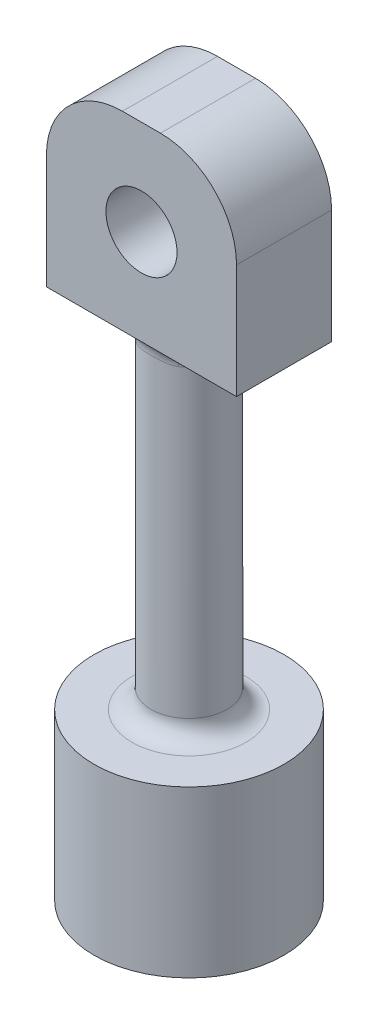
ISO-10303-21;
HEADER;
FILE_DESCRIPTION(('STEP AP214'),'2;1');
FILE_NAME('part.step','',(''),(''),'','','');
FILE_SCHEMA(('AUTOMOTIVE_DESIGN { 1 0 10303 214 1 1 1 1 }'));
ENDSEC;
DATA;
#1=APPLICATION_CONTEXT('core data for automotive mechanical design processes');
#2=APPLICATION_PROTOCOL_DEFINITION('international standard','automotive_design',2000,#1);
#3=PRODUCT_CONTEXT('',#1,'mechanical');
#4=PRODUCT('Part','Part','',(#3));
#5=PRODUCT_RELATED_PRODUCT_CATEGORY('part','',(#4));
#6=PRODUCT_DEFINITION_FORMATION('','',#4);
#7=PRODUCT_DEFINITION_CONTEXT('part definition',#1,'design');
#8=PRODUCT_DEFINITION('design','',#6,#7);
#9=PRODUCT_DEFINITION_SHAPE('','',#8);
#10=(LENGTH_UNIT() NAMED_UNIT(*) SI_UNIT(.MILLI.,.METRE.));
#11=(NAMED_UNIT(*) PLANE_ANGLE_UNIT() SI_UNIT($,.RADIAN.));
#12=(NAMED_UNIT(*) SI_UNIT($,.STERADIAN.) SOLID_ANGLE_UNIT());
#13=UNCERTAINTY_MEASURE_WITH_UNIT(LENGTH_MEASURE(1.E-05),#10,'distance_accuracy_value','');
#14=(GEOMETRIC_REPRESENTATION_CONTEXT(3) GLOBAL_UNCERTAINTY_ASSIGNED_CONTEXT((#13)) GLOBAL_UNIT_ASSIGNED_CONTEXT((#10,
#11,#12)) REPRESENTATION_CONTEXT('',''));
#15=CARTESIAN_POINT('',(0.,0.,0.));
#16=DIRECTION('',(0.,0.,1.));
#17=DIRECTION('',(1.,0.,0.));
#18=AXIS2_PLACEMENT_3D('',#15,#16,#17);
#19=CARTESIAN_POINT('',(0.,1.335,0.));
#20=DIRECTION('',(0.,1.,0.));
#21=DIRECTION('',(0.,0.,1.));
#22=AXIS2_PLACEMENT_3D('',#19,#20,#21);
#23=PLANE('',#22);
#24=DIRECTION('',(1.,0.,0.));
#25=VECTOR('',#24,1.);
#26=CARTESIAN_POINT('',(-0.25,1.335,0.125));
#27=LINE('',#26,#25);
#28=CARTESIAN_POINT('',(0.082915619758885,1.335,0.125));
#29=VERTEX_POINT('',#28);
#30=CARTESIAN_POINT('',(0.25,1.335,0.125));
#31=VERTEX_POINT('',#30);
#32=EDGE_CURVE('E164',#29,#31,#27,.T.);
#33=ORIENTED_EDGE('',*,*,#32,.F.);
#34=CARTESIAN_POINT('',(0.,1.335,0.));
#35=DIRECTION('',(0.,1.,0.));
#36=DIRECTION('',(0.,0.,1.));
#37=AXIS2_PLACEMENT_3D('',#34,#35,#36);
#38=CIRCLE('',#37,0.15);
#39=CARTESIAN_POINT('',(0.082915619758885,1.335,-0.125));
#40=VERTEX_POINT('',#39);
#41=EDGE_CURVE('E139',#29,#40,#38,.T.);
#42=ORIENTED_EDGE('',*,*,#41,.T.);
#43=DIRECTION('',(-1.,0.,0.));
#44=VECTOR('',#43,1.);
#45=CARTESIAN_POINT('',(-0.25,1.335,-0.125));
#46=LINE('',#45,#44);
#47=CARTESIAN_POINT('',(0.25,1.335,-0.125));
#48=VERTEX_POINT('',#47);
#49=EDGE_CURVE('E123',#48,#40,#46,.T.);
#50=ORIENTED_EDGE('',*,*,#49,.F.);
#51=DIRECTION('',(0.,0.,-1.));
#52=VECTOR('',#51,1.);
#53=CARTESIAN_POINT('',(0.25,1.335,-0.125));
#54=LINE('',#53,#52);
#55=EDGE_CURVE('E137',#31,#48,#54,.T.);
#56=ORIENTED_EDGE('',*,*,#55,.F.);
#57=EDGE_LOOP('',(#33,#42,#50,#56));
#58=FACE_BOUND('',#57,.T.);
#59=ADVANCED_FACE('F41',(#58),#23,.F.);
#60=CARTESIAN_POINT('',(0.,0.435,0.));
#61=DIRECTION('',(0.,-1.,0.));
#62=DIRECTION('',(0.,0.,-1.));
#63=AXIS2_PLACEMENT_3D('',#60,#61,#62);
#64=CYLINDRICAL_SURFACE('',#63,0.25);
#65=CARTESIAN_POINT('',(0.,0.435,0.));
#66=DIRECTION('',(0.,1.,0.));
#67=DIRECTION('',(0.,0.,1.));
#68=AXIS2_PLACEMENT_3D('',#65,#66,#67);
#69=CIRCLE('',#68,0.25);
#70=CARTESIAN_POINT('',(0.,0.435,0.25));
#71=VERTEX_POINT('',#70);
#72=EDGE_CURVE('E179',#71,#71,#69,.T.);
#73=ORIENTED_EDGE('',*,*,#72,.F.);
#74=EDGE_LOOP('',(#73));
#75=FACE_BOUND('',#74,.T.);
#76=CARTESIAN_POINT('',(0.,0.,0.));
#77=DIRECTION('',(0.,1.,0.));
#78=DIRECTION('',(0.,0.,1.));
#79=AXIS2_PLACEMENT_3D('',#76,#77,#78);
#80=CIRCLE('',#79,0.25);
#81=CARTESIAN_POINT('',(0.,0.,0.25));
#82=VERTEX_POINT('',#81);
#83=EDGE_CURVE('E131',#82,#82,#80,.T.);
#84=ORIENTED_EDGE('',*,*,#83,.T.);
#85=EDGE_LOOP('',(#84));
#86=FACE_BOUND('',#85,.T.);
#87=ADVANCED_FACE('F346',(#75,#86),#64,.T.);
#88=CARTESIAN_POINT('',(0.,0.435,0.));
#89=DIRECTION('',(0.,1.,0.));
#90=DIRECTION('',(0.,0.,1.));
#91=AXIS2_PLACEMENT_3D('',#88,#89,#90);
#92=PLANE('',#91);
#93=CARTESIAN_POINT('',(0.,0.435,0.));
#94=DIRECTION('',(0.,1.,0.));
#95=DIRECTION('',(0.,0.,1.));
#96=AXIS2_PLACEMENT_3D('',#93,#94,#95);
#97=CIRCLE('',#96,0.15);
#98=CARTESIAN_POINT('',(0.,0.435,0.15));
#99=VERTEX_POINT('',#98);
#100=EDGE_CURVE('E11',#99,#99,#97,.F.);
#101=ORIENTED_EDGE('',*,*,#100,.T.);
#102=EDGE_LOOP('',(#101));
#103=FACE_BOUND('',#102,.T.);
#104=ORIENTED_EDGE('',*,*,#72,.T.);
#105=EDGE_LOOP('',(#104));
#106=FACE_BOUND('',#105,.T.);
#107=ADVANCED_FACE('F350',(#103,#106),#92,.T.);
#108=CARTESIAN_POINT('',(0.,0.,0.));
#109=DIRECTION('',(0.,1.,0.));
#110=DIRECTION('',(0.,0.,1.));
#111=AXIS2_PLACEMENT_3D('',#108,#109,#110);
#112=PLANE('',#111);
#113=ORIENTED_EDGE('',*,*,#83,.F.);
#114=EDGE_LOOP('',(#113));
#115=FACE_BOUND('',#114,.T.);
#116=ADVANCED_FACE('F370',(#115),#112,.F.);
#117=CARTESIAN_POINT('',(0.,1.335,0.));
#118=DIRECTION('',(0.,-1.,0.));
#119=DIRECTION('',(0.,0.,-1.));
#120=AXIS2_PLACEMENT_3D('',#117,#118,#119);
#121=CYLINDRICAL_SURFACE('',#120,0.1);
#122=CARTESIAN_POINT('',(0.,0.485,0.));
#123=DIRECTION('',(0.,1.,0.));
#124=DIRECTION('',(0.,0.,1.));
#125=AXIS2_PLACEMENT_3D('',#122,#123,#124);
#126=CIRCLE('',#125,0.1);
#127=CARTESIAN_POINT('',(0.,0.485,0.1));
#128=VERTEX_POINT('',#127);
#129=EDGE_CURVE('E50',#128,#128,#126,.T.);
#130=ORIENTED_EDGE('',*,*,#129,.T.);
#131=EDGE_LOOP('',(#130));
#132=FACE_BOUND('',#131,.T.);
#133=CARTESIAN_POINT('',(-0.108561947257129,1.335,0.125));
#134=CARTESIAN_POINT('',(-0.0571162837268185,1.35403583939084,0.0850096782033543));
#135=CARTESIAN_POINT('',(-0.0723746315047528,1.28985383210074,0.0690066135566095));
#136=CARTESIAN_POINT('',(-0.105724168479341,1.335,0.125));
#137=CARTESIAN_POINT('',(-0.0580099933726406,1.35170316919863,0.0831957017639458));
#138=CARTESIAN_POINT('',(-0.0704827788521188,1.28843725584,0.0709959026641309));
#139=CARTESIAN_POINT('',(-0.102686668673819,1.335,0.125));
#140=CARTESIAN_POINT('',(-0.0584911358428412,1.3490566128786,0.0821809890806205));
#141=CARTESIAN_POINT('',(-0.0684577789609958,1.28739704937079,0.072950724094474));
#142=CARTESIAN_POINT('',(-0.0963280489440124,1.335,0.125));
#143=CARTESIAN_POINT('',(-0.0585295506126141,1.34388055681319,0.0813724435440272));
#144=CARTESIAN_POINT('',(-0.0642186991875022,1.28591300630558,0.0767054050172059));
#145=CARTESIAN_POINT('',(-0.0930105380361356,1.335,0.125));
#146=CARTESIAN_POINT('',(-0.0581370739161316,1.34135099110951,0.0815131281205083));
#147=CARTESIAN_POINT('',(-0.0620070253150746,1.28546253713962,0.0785067710727673));
#148=CARTESIAN_POINT('',(-0.0790103739437904,1.335,0.125));
#149=CARTESIAN_POINT('',(-0.0549034565275012,1.33252361073601,0.083440803453822));
#150=CARTESIAN_POINT('',(-0.0526735827594274,1.28447308816901,0.0854546022267339));
#151=CARTESIAN_POINT('',(-0.0673305657156679,1.335,0.125));
#152=CARTESIAN_POINT('',(-0.0488214738654429,1.32764063347322,0.0878162809667359));
#153=CARTESIAN_POINT('',(-0.0448870438457596,1.2856904332384,0.0897851364635705));
#154=CARTESIAN_POINT('',(-0.0419979719113123,1.335,0.125));
#155=CARTESIAN_POINT('',(-0.0325534403305831,1.32205084868934,0.0950731532254087));
#156=CARTESIAN_POINT('',(-0.0279986479032146,1.28871923767388,0.096462419172726));
#157=CARTESIAN_POINT('',(-0.028265662772174,1.335,0.125));
#158=CARTESIAN_POINT('',(-0.0219583922863389,1.32111017020412,0.0981925457759286));
#159=CARTESIAN_POINT('',(-0.0188437751739165,1.29056479303117,0.0986582681023733));
#160=CARTESIAN_POINT('',(-0.00601228805778422,1.335,0.125));
#161=CARTESIAN_POINT('',(-0.00474353422634918,1.3205377690155,0.100097798358669));
#162=CARTESIAN_POINT('',(-0.00400819204296949,1.29175447310882,0.100070499657983));
#163=CARTESIAN_POINT('',(0.00233894965746661,1.335,0.125));
#164=CARTESIAN_POINT('',(0.00186314624088005,1.32051436326207,0.100179601405312));
#165=CARTESIAN_POINT('',(0.00155929977062491,1.29181362539728,0.100138958115663));
#166=CARTESIAN_POINT('',(0.018918769396986,1.335,0.125));
#167=CARTESIAN_POINT('',(0.0147012696194538,1.32081738622414,0.0991471678284059));
#168=CARTESIAN_POINT('',(0.0126125129323469,1.2911528195719,0.0993583161004836));
#169=CARTESIAN_POINT('',(0.0271468464963179,1.335,0.125));
#170=CARTESIAN_POINT('',(0.0210673364630624,1.32115153864871,0.0980065635111398));
#171=CARTESIAN_POINT('',(0.018097897663834,1.29043024943636,0.0985061394611566));
#172=CARTESIAN_POINT('',(0.0498614216109891,1.335,0.125));
#173=CARTESIAN_POINT('',(0.0378399985182561,1.32333549353212,0.0933198913233838));
#174=CARTESIAN_POINT('',(0.0332409477413307,1.28791072842075,0.0948434884943914));
#175=CARTESIAN_POINT('',(0.0639884873456313,1.335,0.125));
#176=CARTESIAN_POINT('',(0.0473852155653988,1.32638135684997,0.0883269820611768));
#177=CARTESIAN_POINT('',(0.0426589915709402,1.28571803082568,0.0910034571124549));
#178=CARTESIAN_POINT('',(0.0809757940422209,1.335,0.125));
#179=CARTESIAN_POINT('',(0.0546992775339381,1.33386561831596,0.0837571812340691));
#180=CARTESIAN_POINT('',(0.0539838626925914,1.28496235421669,0.0842347574640487));
#181=CARTESIAN_POINT('',(0.0848783159808821,1.335,0.125));
#182=CARTESIAN_POINT('',(0.0561085584009461,1.336056110028,0.082768559392106));
#183=CARTESIAN_POINT('',(0.0565855439814992,1.28493837909165,0.082508648990688));
#184=CARTESIAN_POINT('',(0.0924270554819615,1.335,0.125));
#185=CARTESIAN_POINT('',(0.0580616156547579,1.34093492876437,0.0815225350568602));
#186=CARTESIAN_POINT('',(0.06161803697976,1.28538233300948,0.0788230421730654));
#187=CARTESIAN_POINT('',(0.0960716871019856,1.335,0.125));
#188=CARTESIAN_POINT('',(0.0585598165198814,1.34365472343558,0.0813039904972027));
#189=CARTESIAN_POINT('',(0.0640477913942099,1.28585306376332,0.076862270856544));
#190=CARTESIAN_POINT('',(0.0995467498805057,1.335,0.125));
#191=CARTESIAN_POINT('',(0.0585104253278343,1.34644082893277,0.0817726615139245));
#192=CARTESIAN_POINT('',(0.0663644999203371,1.28666426789974,0.0748047668957238));
#193=(BOUNDED_SURFACE() B_SPLINE_SURFACE(3,2,((#133,#134,#135),(#136,#137,#138),(#139,#140,
#141),(#142,#143,#144),(#145,#146,#147),(#148,#149,#150),(#151,#152,#153),(#154,#155,#156),
(#157,#158,#159),(#160,#161,#162),(#163,#164,#165),(#166,#167,#168),(#169,#170,#171),(#172,#173,
#174),(#175,#176,#177),(#178,#179,#180),(#181,#182,#183),(#184,#185,#186),(#187,#188,#189),
(#190,#191,#192)),.UNSPECIFIED.,.F.,.F.,.F.) B_SPLINE_SURFACE_WITH_KNOTS((4,2,2,2,2,2,2,2,2,4),
(3,3),(0.,0.013004060914361,0.0258605762789968,0.0653974877027278,0.107560932638333,
0.132451060517196,0.157424613048316,0.202733269596915,0.216746329476959,0.230839180611311),(0.,
1.),.UNSPECIFIED.) GEOMETRIC_REPRESENTATION_ITEM() RATIONAL_B_SPLINE_SURFACE(((1.,
0.593046572981471,1.),(1.,0.60677946280559,1.),(1.,0.621334840894186,1.),(1.,0.650726469007368,
1.),(1.,0.665557658450868,1.),(1.,0.72453594741655,1.),(1.,0.765648180301432,1.),(1.,
0.830297574603738,1.),(1.,0.852485741784742,1.),(1.,0.866736952772142,1.),(1.,0.867417588593249,
1.),(1.,0.859557397145545,1.),(1.,0.850985654500491,1.),(1.,0.81445733448575,1.),(1.,
0.776399662582592,1.),(1.,0.71501434801335,1.),(1.,0.699669472161443,1.),(1.,0.668137116196062,
1.),(1.,0.651945335757421,1.),(1.,0.635848556145242,1.))) REPRESENTATION_ITEM('') SURFACE());
#194=CARTESIAN_POINT('',(0.0663644999203371,1.28666426789974,0.0748047668957238));
#195=CARTESIAN_POINT('',(0.0640477913942099,1.28585306376332,0.076862270856544));
#196=CARTESIAN_POINT('',(0.06161803697976,1.28538233300948,0.0788230421730654));
#197=CARTESIAN_POINT('',(0.0565855439814992,1.28493837909165,0.082508648990688));
#198=CARTESIAN_POINT('',(0.0539838626925914,1.28496235421669,0.0842347574640487));
#199=CARTESIAN_POINT('',(0.0426589915709402,1.28571803082568,0.0910034571124549));
#200=CARTESIAN_POINT('',(0.0332409477413306,1.28791072842075,0.0948434884943914));
#201=CARTESIAN_POINT('',(0.018097897663834,1.29043024943636,0.0985061394611566));
#202=CARTESIAN_POINT('',(0.0126125129323469,1.2911528195719,0.0993583161004836));
#203=CARTESIAN_POINT('',(0.00155929977062491,1.29181362539728,0.100138958115663));
#204=CARTESIAN_POINT('',(-0.0040081920429695,1.29175447310882,0.100070499657983));
#205=CARTESIAN_POINT('',(-0.0188437751739165,1.29056479303117,0.0986582681023733));
#206=CARTESIAN_POINT('',(-0.0279986479032145,1.28871923767388,0.096462419172726));
#207=CARTESIAN_POINT('',(-0.0448870438457596,1.2856904332384,0.0897851364635705));
#208=CARTESIAN_POINT('',(-0.0526735827594274,1.28447308816901,0.0854546022267339));
#209=CARTESIAN_POINT('',(-0.0620070253150746,1.28546253713962,0.0785067710727673));
#210=CARTESIAN_POINT('',(-0.0642186991875022,1.28591300630558,0.0767054050172059));
#211=CARTESIAN_POINT('',(-0.0684577789609958,1.28739704937079,0.072950724094474));
#212=CARTESIAN_POINT('',(-0.0704827788521188,1.28843725584,0.0709959026641309));
#213=CARTESIAN_POINT('',(-0.0723746315047528,1.28985383210074,0.0690066135566095));
#214=B_SPLINE_CURVE_WITH_KNOTS('',3,(#194,#195,#196,#197,#198,#199,#200,#201,#202,#203,#204,
#205,#206,#207,#208,#209,#210,#211,#212,#213),.UNSPECIFIED.,.F.,.F.,(4,2,2,2,2,2,2,2,2,4),(0.,
0.0140928511343528,0.0281059110143969,0.0734145675629949,0.0983881200941158,0.123278247972978,
0.165441692908584,0.204978604332315,0.21783511969695,0.230839180611311),.UNSPECIFIED.);
#215=CARTESIAN_POINT('',(0.0552770798392566,1.285,0.0833333333333333));
#216=VERTEX_POINT('',#215);
#217=CARTESIAN_POINT('',(-0.0552770798392566,1.285,0.0833333333333333));
#218=VERTEX_POINT('',#217);
#219=EDGE_CURVE('E217',#216,#218,#214,.T.);
#220=ORIENTED_EDGE('',*,*,#219,.T.);
#221=CARTESIAN_POINT('',(0.,1.285,0.));
#222=DIRECTION('',(0.,1.,0.));
#223=DIRECTION('',(0.,0.,1.));
#224=AXIS2_PLACEMENT_3D('',#221,#222,#223);
#225=CIRCLE('',#224,0.1);
#226=CARTESIAN_POINT('',(-0.0552770798392567,1.285,-0.0833333333333333));
#227=VERTEX_POINT('',#226);
#228=EDGE_CURVE('E57',#218,#227,#225,.F.);
#229=ORIENTED_EDGE('',*,*,#228,.T.);
#230=CARTESIAN_POINT('',(0.10856194725713,1.335,-0.125));
#231=CARTESIAN_POINT('',(0.0571162837268186,1.35403583939084,-0.0850096782033544));
#232=CARTESIAN_POINT('',(0.072374631504753,1.28985383210074,-0.0690066135566093));
#233=CARTESIAN_POINT('',(0.105724168479342,1.335,-0.125));
#234=CARTESIAN_POINT('',(0.0580099933726406,1.35170316919863,-0.0831957017639459));
#235=CARTESIAN_POINT('',(0.070482778852119,1.28843725584,-0.0709959026641307));
#236=CARTESIAN_POINT('',(0.102686668673819,1.335,-0.125));
#237=CARTESIAN_POINT('',(0.0584911358428413,1.3490566128786,-0.0821809890806206));
#238=CARTESIAN_POINT('',(0.068457778960996,1.28739704937079,-0.0729507240944738));
#239=CARTESIAN_POINT('',(0.0963280489440128,1.335,-0.125));
#240=CARTESIAN_POINT('',(0.0585295506126141,1.34388055681319,-0.0813724435440272));
#241=CARTESIAN_POINT('',(0.0642186991875025,1.28591300630558,-0.0767054050172057));
#242=CARTESIAN_POINT('',(0.093010538036136,1.335,-0.125));
#243=CARTESIAN_POINT('',(0.0581370739161317,1.34135099110951,-0.0815131281205083));
#244=CARTESIAN_POINT('',(0.0620070253150749,1.28546253713962,-0.078506771072767));
#245=CARTESIAN_POINT('',(0.0790103739437909,1.335,-0.125));
#246=CARTESIAN_POINT('',(0.0549034565275014,1.33252361073601,-0.0834408034538218));
#247=CARTESIAN_POINT('',(0.0526735827594278,1.28447308816901,-0.0854546022267337));
#248=CARTESIAN_POINT('',(0.0673305657156686,1.335,-0.125));
#249=CARTESIAN_POINT('',(0.0488214738654433,1.32764063347322,-0.0878162809667356));
#250=CARTESIAN_POINT('',(0.04488704384576,1.2856904332384,-0.0897851364635703));
#251=CARTESIAN_POINT('',(0.0419979719113132,1.335,-0.125));
#252=CARTESIAN_POINT('',(0.0325534403305838,1.32205084868934,-0.0950731532254085));
#253=CARTESIAN_POINT('',(0.0279986479032152,1.28871923767388,-0.0964624191727258));
#254=CARTESIAN_POINT('',(0.0282656627721751,1.335,-0.125));
#255=CARTESIAN_POINT('',(0.0219583922863397,1.32111017020412,-0.0981925457759284));
#256=CARTESIAN_POINT('',(0.0188437751739173,1.29056479303117,-0.0986582681023732));
#257=CARTESIAN_POINT('',(0.00601228805778544,1.335,-0.125));
#258=CARTESIAN_POINT('',(0.00474353422635014,1.3205377690155,-0.100097798358669));
#259=CARTESIAN_POINT('',(0.0040081920429703,1.29175447310882,-0.100070499657983));
#260=CARTESIAN_POINT('',(-0.00233894965746542,1.335,-0.125));
#261=CARTESIAN_POINT('',(-0.00186314624087911,1.32051436326207,-0.100179601405312));
#262=CARTESIAN_POINT('',(-0.0015592997706241,1.29181362539728,-0.100138958115663));
#263=CARTESIAN_POINT('',(-0.0189187693969849,1.335,-0.125));
#264=CARTESIAN_POINT('',(-0.0147012696194529,1.32081738622414,-0.0991471678284061));
#265=CARTESIAN_POINT('',(-0.0126125129323462,1.2911528195719,-0.0993583161004837));
#266=CARTESIAN_POINT('',(-0.0271468464963168,1.335,-0.125));
#267=CARTESIAN_POINT('',(-0.0210673364630615,1.32115153864871,-0.09800656351114));
#268=CARTESIAN_POINT('',(-0.0180978976638332,1.29043024943636,-0.0985061394611567));
#269=CARTESIAN_POINT('',(-0.049861421610988,1.335,-0.125));
#270=CARTESIAN_POINT('',(-0.0378399985182554,1.32333549353212,-0.0933198913233841));
#271=CARTESIAN_POINT('',(-0.0332409477413299,1.28791072842075,-0.0948434884943917));
#272=CARTESIAN_POINT('',(-0.0639884873456301,1.335,-0.125));
#273=CARTESIAN_POINT('',(-0.0473852155653981,1.32638135684997,-0.0883269820611772));
#274=CARTESIAN_POINT('',(-0.0426589915709395,1.28571803082568,-0.0910034571124552));
#275=CARTESIAN_POINT('',(-0.0809757940422199,1.335,-0.125));
#276=CARTESIAN_POINT('',(-0.0546992775339377,1.33386561831596,-0.0837571812340694));
#277=CARTESIAN_POINT('',(-0.0539838626925907,1.28496235421669,-0.0842347574640492));
#278=CARTESIAN_POINT('',(-0.0848783159808811,1.335,-0.125));
#279=CARTESIAN_POINT('',(-0.0561085584009458,1.336056110028,-0.0827685593921063));
#280=CARTESIAN_POINT('',(-0.0565855439814985,1.28493837909165,-0.0825086489906884));
#281=CARTESIAN_POINT('',(-0.0924270554819608,1.335,-0.125));
#282=CARTESIAN_POINT('',(-0.0580616156547579,1.34093492876437,-0.0815225350568603));
#283=CARTESIAN_POINT('',(-0.0616180369797594,1.28538233300948,-0.0788230421730658));
#284=CARTESIAN_POINT('',(-0.096071687101985,1.335,-0.125));
#285=CARTESIAN_POINT('',(-0.0585598165198814,1.34365472343558,-0.0813039904972026));
#286=CARTESIAN_POINT('',(-0.0640477913942095,1.28585306376332,-0.0768622708565443));
#287=CARTESIAN_POINT('',(-0.0995467498805051,1.335,-0.125));
#288=CARTESIAN_POINT('',(-0.0585104253278344,1.34644082893277,-0.0817726615139244));
#289=CARTESIAN_POINT('',(-0.0663644999203367,1.28666426789974,-0.0748047668957242));
#290=(BOUNDED_SURFACE() B_SPLINE_SURFACE(3,2,((#230,#231,#232),(#233,#234,#235),(#236,#237,
#238),(#239,#240,#241),(#242,#243,#244),(#245,#246,#247),(#248,#249,#250),(#251,#252,#253),
(#254,#255,#256),(#257,#258,#259),(#260,#261,#262),(#263,#264,#265),(#266,#267,#268),(#269,#270,
#271),(#272,#273,#274),(#275,#276,#277),(#278,#279,#280),(#281,#282,#283),(#284,#285,#286),
(#287,#288,#289)),.UNSPECIFIED.,.F.,.F.,.F.) B_SPLINE_SURFACE_WITH_KNOTS((4,2,2,2,2,2,2,2,2,4),
(3,3),(0.,0.0130040609143609,0.0258605762789967,0.0653974877027272,0.107560932638332,
0.132451060517195,0.157424613048316,0.202733269596914,0.216746329476958,0.230839180611311),(0.,
1.),.UNSPECIFIED.) GEOMETRIC_REPRESENTATION_ITEM() RATIONAL_B_SPLINE_SURFACE(((1.,
0.59304657298147,1.),(1.,0.606779462805589,1.),(1.,0.621334840894185,1.),(1.,0.650726469007367,
1.),(1.,0.665557658450866,1.),(1.,0.724535947416548,1.),(1.,0.765648180301429,1.),(1.,
0.830297574603736,1.),(1.,0.852485741784741,1.),(1.,0.866736952772142,1.),(1.,0.86741758859325,
1.),(1.,0.859557397145547,1.),(1.,0.850985654500493,1.),(1.,0.814457334485753,1.),(1.,
0.776399662582596,1.),(1.,0.715014348013355,1.),(1.,0.699669472161447,1.),(1.,0.668137116196066,
1.),(1.,0.651945335757425,1.),(1.,0.635848556145245,1.))) REPRESENTATION_ITEM('') SURFACE());
#291=CARTESIAN_POINT('',(-0.0663644999203367,1.28666426789974,-0.0748047668957242));
#292=CARTESIAN_POINT('',(-0.0640477913942095,1.28585306376332,-0.0768622708565444));
#293=CARTESIAN_POINT('',(-0.0616180369797595,1.28538233300948,-0.0788230421730658));
#294=CARTESIAN_POINT('',(-0.0565855439814985,1.28493837909165,-0.0825086489906884));
#295=CARTESIAN_POINT('',(-0.0539838626925907,1.28496235421669,-0.0842347574640492));
#296=CARTESIAN_POINT('',(-0.0426589915709395,1.28571803082568,-0.0910034571124552));
#297=CARTESIAN_POINT('',(-0.0332409477413299,1.28791072842075,-0.0948434884943917));
#298=CARTESIAN_POINT('',(-0.0180978976638332,1.29043024943636,-0.0985061394611567));
#299=CARTESIAN_POINT('',(-0.0126125129323462,1.2911528195719,-0.0993583161004837));
#300=CARTESIAN_POINT('',(-0.0015592997706241,1.29181362539728,-0.100138958115663));
#301=CARTESIAN_POINT('',(0.00400819204297031,1.29175447310882,-0.100070499657983));
#302=CARTESIAN_POINT('',(0.0188437751739173,1.29056479303117,-0.0986582681023732));
#303=CARTESIAN_POINT('',(0.0279986479032152,1.28871923767388,-0.0964624191727259));
#304=CARTESIAN_POINT('',(0.04488704384576,1.2856904332384,-0.0897851364635703));
#305=CARTESIAN_POINT('',(0.0526735827594278,1.28447308816901,-0.0854546022267337));
#306=CARTESIAN_POINT('',(0.0620070253150749,1.28546253713962,-0.078506771072767));
#307=CARTESIAN_POINT('',(0.0642186991875025,1.28591300630558,-0.0767054050172057));
#308=CARTESIAN_POINT('',(0.068457778960996,1.28739704937079,-0.0729507240944738));
#309=CARTESIAN_POINT('',(0.070482778852119,1.28843725584,-0.0709959026641307));
#310=CARTESIAN_POINT('',(0.072374631504753,1.28985383210074,-0.0690066135566093));
#311=B_SPLINE_CURVE_WITH_KNOTS('',3,(#291,#292,#293,#294,#295,#296,#297,#298,#299,#300,#301,
#302,#303,#304,#305,#306,#307,#308,#309,#310),.UNSPECIFIED.,.F.,.F.,(4,2,2,2,2,2,2,2,2,4),(0.,
0.0140928511343531,0.0281059110143974,0.0734145675629953,0.0983881200941162,0.123278247972978,
0.165441692908584,0.204978604332314,0.21783511969695,0.230839180611311),.UNSPECIFIED.);
#312=CARTESIAN_POINT('',(0.0552770798392567,1.285,-0.0833333333333333));
#313=VERTEX_POINT('',#312);
#314=EDGE_CURVE('E61',#227,#313,#311,.T.);
#315=ORIENTED_EDGE('',*,*,#314,.T.);
#316=CARTESIAN_POINT('',(0.,1.285,0.));
#317=DIRECTION('',(0.,1.,0.));
#318=DIRECTION('',(0.,0.,1.));
#319=AXIS2_PLACEMENT_3D('',#316,#317,#318);
#320=CIRCLE('',#319,0.1);
#321=EDGE_CURVE('E226',#313,#216,#320,.F.);
#322=ORIENTED_EDGE('',*,*,#321,.T.);
#323=EDGE_LOOP('',(#220,#229,#315,#322));
#324=FACE_BOUND('',#323,.T.);
#325=ADVANCED_FACE('F228',(#132,#324),#121,.T.);
#326=CARTESIAN_POINT('',(0.25,1.835,-0.125));
#327=DIRECTION('',(-1.,0.,0.));
#328=DIRECTION('',(0.,0.,1.));
#329=AXIS2_PLACEMENT_3D('',#326,#327,#328);
#330=PLANE('',#329);
#331=DIRECTION('',(0.,-1.,0.));
#332=VECTOR('',#331,1.);
#333=CARTESIAN_POINT('',(0.25,1.835,-0.125));
#334=LINE('',#333,#332);
#335=CARTESIAN_POINT('',(0.25,1.635,-0.125));
#336=VERTEX_POINT('',#335);
#337=EDGE_CURVE('E118',#336,#48,#334,.T.);
#338=ORIENTED_EDGE('',*,*,#337,.F.);
#339=DIRECTION('',(0.,0.,-1.));
#340=VECTOR('',#339,1.);
#341=CARTESIAN_POINT('',(0.25,1.635,0.125));
#342=LINE('',#341,#340);
#343=CARTESIAN_POINT('',(0.25,1.635,0.125));
#344=VERTEX_POINT('',#343);
#345=EDGE_CURVE('E192',#336,#344,#342,.F.);
#346=ORIENTED_EDGE('',*,*,#345,.T.);
#347=DIRECTION('',(0.,-1.,0.));
#348=VECTOR('',#347,1.);
#349=CARTESIAN_POINT('',(0.25,1.835,0.125));
#350=LINE('',#349,#348);
#351=EDGE_CURVE('E148',#344,#31,#350,.T.);
#352=ORIENTED_EDGE('',*,*,#351,.T.);
#353=ORIENTED_EDGE('',*,*,#55,.T.);
#354=EDGE_LOOP('',(#338,#346,#352,#353));
#355=FACE_BOUND('',#354,.T.);
#356=ADVANCED_FACE('F146',(#355),#330,.F.);
#357=CARTESIAN_POINT('',(-0.25,1.835,-0.125));
#358=DIRECTION('',(0.,0.,1.));
#359=DIRECTION('',(1.,0.,0.));
#360=AXIS2_PLACEMENT_3D('',#357,#358,#359);
#361=PLANE('',#360);
#362=CARTESIAN_POINT('',(0.,1.585,-0.125));
#363=DIRECTION('',(0.,0.,1.));
#364=DIRECTION('',(1.,0.,0.));
#365=AXIS2_PLACEMENT_3D('',#362,#363,#364);
#366=CIRCLE('',#365,0.0935);
#367=CARTESIAN_POINT('',(0.0935,1.585,-0.125));
#368=VERTEX_POINT('',#367);
#369=EDGE_CURVE('E150',#368,#368,#366,.T.);
#370=ORIENTED_EDGE('',*,*,#369,.T.);
#371=EDGE_LOOP('',(#370));
#372=FACE_BOUND('',#371,.T.);
#373=DIRECTION('',(0.,-1.,0.));
#374=VECTOR('',#373,1.);
#375=CARTESIAN_POINT('',(-0.25,1.835,-0.125));
#376=LINE('',#375,#374);
#377=CARTESIAN_POINT('',(-0.25,1.635,-0.125));
#378=VERTEX_POINT('',#377);
#379=CARTESIAN_POINT('',(-0.25,1.335,-0.125));
#380=VERTEX_POINT('',#379);
#381=EDGE_CURVE('E132',#378,#380,#376,.T.);
#382=ORIENTED_EDGE('',*,*,#381,.F.);
#383=CARTESIAN_POINT('',(-0.0499999999999999,1.635,-0.125));
#384=DIRECTION('',(0.,0.,1.));
#385=DIRECTION('',(1.,0.,0.));
#386=AXIS2_PLACEMENT_3D('',#383,#384,#385);
#387=CIRCLE('',#386,0.2);
#388=CARTESIAN_POINT('',(-0.0499999999999999,1.835,-0.125));
#389=VERTEX_POINT('',#388);
#390=EDGE_CURVE('E209',#378,#389,#387,.F.);
#391=ORIENTED_EDGE('',*,*,#390,.T.);
#392=DIRECTION('',(-1.,0.,0.));
#393=VECTOR('',#392,1.);
#394=CARTESIAN_POINT('',(-0.25,1.835,-0.125));
#395=LINE('',#394,#393);
#396=CARTESIAN_POINT('',(0.05,1.835,-0.125));
#397=VERTEX_POINT('',#396);
#398=EDGE_CURVE('E169',#397,#389,#395,.T.);
#399=ORIENTED_EDGE('',*,*,#398,.F.);
#400=CARTESIAN_POINT('',(0.05,1.635,-0.125));
#401=DIRECTION('',(0.,0.,1.));
#402=DIRECTION('',(1.,0.,0.));
#403=AXIS2_PLACEMENT_3D('',#400,#401,#402);
#404=CIRCLE('',#403,0.2);
#405=EDGE_CURVE('E126',#397,#336,#404,.F.);
#406=ORIENTED_EDGE('',*,*,#405,.T.);
#407=ORIENTED_EDGE('',*,*,#337,.T.);
#408=ORIENTED_EDGE('',*,*,#49,.T.);
#409=CARTESIAN_POINT('',(-0.0829156197588851,1.335,-0.125));
#410=VERTEX_POINT('',#409);
#411=EDGE_CURVE('E142',#40,#410,#46,.T.);
#412=ORIENTED_EDGE('',*,*,#411,.T.);
#413=EDGE_CURVE('E144',#410,#380,#46,.T.);
#414=ORIENTED_EDGE('',*,*,#413,.T.);
#415=EDGE_LOOP('',(#382,#391,#399,#406,#407,#408,#412,#414));
#416=FACE_BOUND('',#415,.T.);
#417=ADVANCED_FACE('F121',(#372,#416),#361,.F.);
#418=CARTESIAN_POINT('',(-0.25,1.835,-0.125));
#419=DIRECTION('',(1.,0.,0.));
#420=DIRECTION('',(0.,0.,-1.));
#421=AXIS2_PLACEMENT_3D('',#418,#419,#420);
#422=PLANE('',#421);
#423=DIRECTION('',(0.,-1.,0.));
#424=VECTOR('',#423,1.);
#425=CARTESIAN_POINT('',(-0.25,1.835,0.125));
#426=LINE('',#425,#424);
#427=CARTESIAN_POINT('',(-0.25,1.635,0.125));
#428=VERTEX_POINT('',#427);
#429=CARTESIAN_POINT('',(-0.25,1.335,0.125));
#430=VERTEX_POINT('',#429);
#431=EDGE_CURVE('E173',#428,#430,#426,.T.);
#432=ORIENTED_EDGE('',*,*,#431,.F.);
#433=DIRECTION('',(0.,0.,1.));
#434=VECTOR('',#433,1.);
#435=CARTESIAN_POINT('',(-0.25,1.635,-0.125));
#436=LINE('',#435,#434);
#437=EDGE_CURVE('E206',#428,#378,#436,.F.);
#438=ORIENTED_EDGE('',*,*,#437,.T.);
#439=ORIENTED_EDGE('',*,*,#381,.T.);
#440=DIRECTION('',(0.,0.,1.));
#441=VECTOR('',#440,1.);
#442=CARTESIAN_POINT('',(-0.25,1.335,-0.125));
#443=LINE('',#442,#441);
#444=EDGE_CURVE('E141',#380,#430,#443,.T.);
#445=ORIENTED_EDGE('',*,*,#444,.T.);
#446=EDGE_LOOP('',(#432,#438,#439,#445));
#447=FACE_BOUND('',#446,.T.);
#448=ADVANCED_FACE('F359',(#447),#422,.F.);
#449=CARTESIAN_POINT('',(-0.25,1.835,0.125));
#450=DIRECTION('',(0.,0.,-1.));
#451=DIRECTION('',(-1.,0.,0.));
#452=AXIS2_PLACEMENT_3D('',#449,#450,#451);
#453=PLANE('',#452);
#454=CARTESIAN_POINT('',(0.,1.585,0.125));
#455=DIRECTION('',(0.,0.,1.));
#456=DIRECTION('',(1.,0.,0.));
#457=AXIS2_PLACEMENT_3D('',#454,#455,#456);
#458=CIRCLE('',#457,0.0935);
#459=CARTESIAN_POINT('',(0.0935,1.585,0.125));
#460=VERTEX_POINT('',#459);
#461=EDGE_CURVE('E155',#460,#460,#458,.T.);
#462=ORIENTED_EDGE('',*,*,#461,.F.);
#463=EDGE_LOOP('',(#462));
#464=FACE_BOUND('',#463,.T.);
#465=DIRECTION('',(1.,0.,0.));
#466=VECTOR('',#465,1.);
#467=CARTESIAN_POINT('',(-0.25,1.835,0.125));
#468=LINE('',#467,#466);
#469=CARTESIAN_POINT('',(-0.0499999999999999,1.835,0.125));
#470=VERTEX_POINT('',#469);
#471=CARTESIAN_POINT('',(0.0500000000000001,1.835,0.125));
#472=VERTEX_POINT('',#471);
#473=EDGE_CURVE('E158',#470,#472,#468,.T.);
#474=ORIENTED_EDGE('',*,*,#473,.F.);
#475=CARTESIAN_POINT('',(-0.0499999999999999,1.635,0.125));
#476=DIRECTION('',(0.,0.,-1.));
#477=DIRECTION('',(-1.,0.,0.));
#478=AXIS2_PLACEMENT_3D('',#475,#476,#477);
#479=CIRCLE('',#478,0.2);
#480=EDGE_CURVE('E203',#470,#428,#479,.F.);
#481=ORIENTED_EDGE('',*,*,#480,.T.);
#482=ORIENTED_EDGE('',*,*,#431,.T.);
#483=CARTESIAN_POINT('',(-0.082915619758885,1.335,0.125));
#484=VERTEX_POINT('',#483);
#485=EDGE_CURVE('E165',#430,#484,#27,.T.);
#486=ORIENTED_EDGE('',*,*,#485,.T.);
#487=EDGE_CURVE('E170',#484,#29,#27,.T.);
#488=ORIENTED_EDGE('',*,*,#487,.T.);
#489=ORIENTED_EDGE('',*,*,#32,.T.);
#490=ORIENTED_EDGE('',*,*,#351,.F.);
#491=CARTESIAN_POINT('',(0.0500000000000001,1.635,0.125));
#492=DIRECTION('',(0.,0.,-1.));
#493=DIRECTION('',(-1.,0.,0.));
#494=AXIS2_PLACEMENT_3D('',#491,#492,#493);
#495=CIRCLE('',#494,0.2);
#496=EDGE_CURVE('E195',#344,#472,#495,.F.);
#497=ORIENTED_EDGE('',*,*,#496,.T.);
#498=EDGE_LOOP('',(#474,#481,#482,#486,#488,#489,#490,#497));
#499=FACE_BOUND('',#498,.T.);
#500=ADVANCED_FACE('F333',(#464,#499),#453,.F.);
#501=CARTESIAN_POINT('',(0.,1.835,0.));
#502=DIRECTION('',(0.,1.,0.));
#503=DIRECTION('',(0.,0.,1.));
#504=AXIS2_PLACEMENT_3D('',#501,#502,#503);
#505=PLANE('',#504);
#506=ORIENTED_EDGE('',*,*,#398,.T.);
#507=DIRECTION('',(0.,0.,1.));
#508=VECTOR('',#507,1.);
#509=CARTESIAN_POINT('',(-0.0499999999999999,1.835,0.125));
#510=LINE('',#509,#508);
#511=EDGE_CURVE('E199',#389,#470,#510,.T.);
#512=ORIENTED_EDGE('',*,*,#511,.T.);
#513=ORIENTED_EDGE('',*,*,#473,.T.);
#514=DIRECTION('',(0.,0.,-1.));
#515=VECTOR('',#514,1.);
#516=CARTESIAN_POINT('',(0.05,1.835,-0.125));
#517=LINE('',#516,#515);
#518=EDGE_CURVE('E183',#472,#397,#517,.T.);
#519=ORIENTED_EDGE('',*,*,#518,.T.);
#520=EDGE_LOOP('',(#506,#512,#513,#519));
#521=FACE_BOUND('',#520,.T.);
#522=ADVANCED_FACE('F329',(#521),#505,.T.);
#523=ORIENTED_EDGE('',*,*,#413,.F.);
#524=CARTESIAN_POINT('',(0.,1.335,0.));
#525=DIRECTION('',(0.,1.,0.));
#526=DIRECTION('',(0.,0.,1.));
#527=AXIS2_PLACEMENT_3D('',#524,#525,#526);
#528=CIRCLE('',#527,0.15);
#529=EDGE_CURVE('E212',#410,#484,#528,.T.);
#530=ORIENTED_EDGE('',*,*,#529,.T.);
#531=ORIENTED_EDGE('',*,*,#485,.F.);
#532=ORIENTED_EDGE('',*,*,#444,.F.);
#533=EDGE_LOOP('',(#523,#530,#531,#532));
#534=FACE_BOUND('',#533,.T.);
#535=ADVANCED_FACE('F337',(#534),#23,.F.);
#536=CARTESIAN_POINT('',(0.05,1.635,0.));
#537=DIRECTION('',(0.,0.,1.));
#538=DIRECTION('',(1.,0.,0.));
#539=AXIS2_PLACEMENT_3D('',#536,#537,#538);
#540=CYLINDRICAL_SURFACE('',#539,0.2);
#541=ORIENTED_EDGE('',*,*,#496,.F.);
#542=ORIENTED_EDGE('',*,*,#345,.F.);
#543=ORIENTED_EDGE('',*,*,#405,.F.);
#544=ORIENTED_EDGE('',*,*,#518,.F.);
#545=EDGE_LOOP('',(#541,#542,#543,#544));
#546=FACE_BOUND('',#545,.T.);
#547=ADVANCED_FACE('F335',(#546),#540,.T.);
#548=CARTESIAN_POINT('',(-0.0499999999999999,1.635,0.));
#549=DIRECTION('',(0.,0.,-1.));
#550=DIRECTION('',(-1.,0.,0.));
#551=AXIS2_PLACEMENT_3D('',#548,#549,#550);
#552=CYLINDRICAL_SURFACE('',#551,0.2);
#553=ORIENTED_EDGE('',*,*,#390,.F.);
#554=ORIENTED_EDGE('',*,*,#437,.F.);
#555=ORIENTED_EDGE('',*,*,#480,.F.);
#556=ORIENTED_EDGE('',*,*,#511,.F.);
#557=EDGE_LOOP('',(#553,#554,#555,#556));
#558=FACE_BOUND('',#557,.T.);
#559=ADVANCED_FACE('F236',(#558),#552,.T.);
#560=CARTESIAN_POINT('',(0.,1.585,-0.125));
#561=DIRECTION('',(0.,0.,1.));
#562=DIRECTION('',(1.,0.,0.));
#563=AXIS2_PLACEMENT_3D('',#560,#561,#562);
#564=CYLINDRICAL_SURFACE('',#563,0.0935);
#565=ORIENTED_EDGE('',*,*,#369,.F.);
#566=EDGE_LOOP('',(#565));
#567=FACE_BOUND('',#566,.T.);
#568=ORIENTED_EDGE('',*,*,#461,.T.);
#569=EDGE_LOOP('',(#568));
#570=FACE_BOUND('',#569,.T.);
#571=ADVANCED_FACE('F277',(#567,#570),#564,.F.);
#572=CARTESIAN_POINT('',(0.0829156197588847,1.285,-0.125));
#573=DIRECTION('',(0.833333333333335,0.,0.552770798392564));
#574=DIRECTION('',(0.552770798392564,0.,-0.833333333333335));
#575=AXIS2_PLACEMENT_3D('',#572,#573,#574);
#576=CIRCLE('',#575,0.05);
#577=EDGE_CURVE('E261',#313,#40,#576,.F.);
#578=ORIENTED_EDGE('',*,*,#577,.F.);
#579=ORIENTED_EDGE('',*,*,#314,.F.);
#580=CARTESIAN_POINT('',(-0.0829156197588985,1.28499999999999,-0.125000000000017));
#581=DIRECTION('',(0.833333333333327,1.89982950259644E-13,-0.552770798392576));
#582=DIRECTION('',(-0.552770798392577,0.,-0.833333333333327));
#583=AXIS2_PLACEMENT_3D('',#580,#581,#582);
#584=CIRCLE('',#583,0.05);
#585=EDGE_CURVE('E312',#410,#227,#584,.T.);
#586=ORIENTED_EDGE('',*,*,#585,.F.);
#587=ORIENTED_EDGE('',*,*,#411,.F.);
#588=EDGE_LOOP('',(#578,#579,#586,#587));
#589=FACE_BOUND('',#588,.T.);
#590=ADVANCED_FACE('F271',(#589),#290,.F.);
#591=CARTESIAN_POINT('',(0.,1.285,0.));
#592=DIRECTION('',(0.,1.,0.));
#593=DIRECTION('',(0.,0.,1.));
#594=AXIS2_PLACEMENT_3D('',#591,#592,#593);
#595=TOROIDAL_SURFACE('',#594,0.15,0.05);
#596=ORIENTED_EDGE('',*,*,#585,.T.);
#597=ORIENTED_EDGE('',*,*,#228,.F.);
#598=CARTESIAN_POINT('',(-0.082915619758885,1.285,0.125));
#599=DIRECTION('',(-0.833333333333333,0.,-0.552770798392566));
#600=DIRECTION('',(-0.552770798392566,0.,0.833333333333334));
#601=AXIS2_PLACEMENT_3D('',#598,#599,#600);
#602=CIRCLE('',#601,0.05);
#603=EDGE_CURVE('E305',#484,#218,#602,.T.);
#604=ORIENTED_EDGE('',*,*,#603,.F.);
#605=ORIENTED_EDGE('',*,*,#529,.F.);
#606=EDGE_LOOP('',(#596,#597,#604,#605));
#607=FACE_BOUND('',#606,.T.);
#608=ADVANCED_FACE('F268',(#607),#595,.F.);
#609=CARTESIAN_POINT('',(0.,1.285,0.));
#610=DIRECTION('',(0.,1.,0.));
#611=DIRECTION('',(0.,0.,1.));
#612=AXIS2_PLACEMENT_3D('',#609,#610,#611);
#613=TOROIDAL_SURFACE('',#612,0.15,0.05);
#614=ORIENTED_EDGE('',*,*,#577,.T.);
#615=ORIENTED_EDGE('',*,*,#41,.F.);
#616=CARTESIAN_POINT('',(0.082915619758885,1.285,0.125));
#617=DIRECTION('',(0.833333333333333,0.,-0.552770798392566));
#618=DIRECTION('',(-0.552770798392566,0.,-0.833333333333334));
#619=AXIS2_PLACEMENT_3D('',#616,#617,#618);
#620=CIRCLE('',#619,0.05);
#621=EDGE_CURVE('E303',#216,#29,#620,.T.);
#622=ORIENTED_EDGE('',*,*,#621,.F.);
#623=ORIENTED_EDGE('',*,*,#321,.F.);
#624=EDGE_LOOP('',(#614,#615,#622,#623));
#625=FACE_BOUND('',#624,.T.);
#626=ADVANCED_FACE('F245',(#625),#613,.F.);
#627=ORIENTED_EDGE('',*,*,#603,.T.);
#628=ORIENTED_EDGE('',*,*,#219,.F.);
#629=ORIENTED_EDGE('',*,*,#621,.T.);
#630=ORIENTED_EDGE('',*,*,#487,.F.);
#631=EDGE_LOOP('',(#627,#628,#629,#630));
#632=FACE_BOUND('',#631,.T.);
#633=ADVANCED_FACE('F240',(#632),#193,.F.);
#634=CARTESIAN_POINT('',(0.,0.485,0.));
#635=DIRECTION('',(0.,1.,0.));
#636=DIRECTION('',(0.,0.,1.));
#637=AXIS2_PLACEMENT_3D('',#634,#635,#636);
#638=TOROIDAL_SURFACE('',#637,0.15,0.05);
#639=ORIENTED_EDGE('',*,*,#100,.F.);
#640=EDGE_LOOP('',(#639));
#641=FACE_BOUND('',#640,.T.);
#642=ORIENTED_EDGE('',*,*,#129,.F.);
#643=EDGE_LOOP('',(#642));
#644=FACE_BOUND('',#643,.T.);
#645=ADVANCED_FACE('F43',(#641,#644),#638,.F.);
#646=CLOSED_SHELL('',(#59,#87,#107,#116,#325,#356,#417,#448,#500,#522,#535,#547,#559,#571,#590,
#608,#626,#633,#645));
#647=MANIFOLD_SOLID_BREP('B2',#646);
#648=ADVANCED_BREP_SHAPE_REPRESENTATION('',(#18,#647),#14);
#649=SHAPE_DEFINITION_REPRESENTATION(#9,#648);
ENDSEC;
END-ISO-10303-21;
